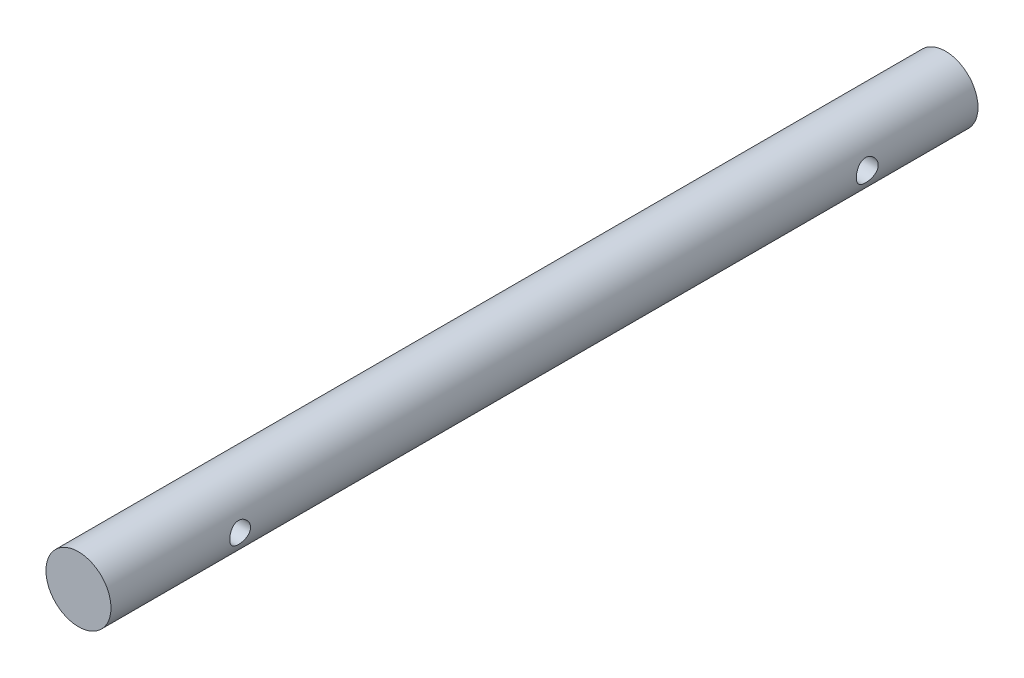
ISO-10303-21;
HEADER;
FILE_DESCRIPTION(('STEP AP214'),'2;1');
FILE_NAME('part.step','',(''),(''),'','','');
FILE_SCHEMA(('AUTOMOTIVE_DESIGN { 1 0 10303 214 1 1 1 1 }'));
ENDSEC;
DATA;
#1=APPLICATION_CONTEXT('core data for automotive mechanical design processes');
#2=APPLICATION_PROTOCOL_DEFINITION('international standard','automotive_design',2000,#1);
#3=PRODUCT_CONTEXT('',#1,'mechanical');
#4=PRODUCT('Part','Part','',(#3));
#5=PRODUCT_RELATED_PRODUCT_CATEGORY('part','',(#4));
#6=PRODUCT_DEFINITION_FORMATION('','',#4);
#7=PRODUCT_DEFINITION_CONTEXT('part definition',#1,'design');
#8=PRODUCT_DEFINITION('design','',#6,#7);
#9=PRODUCT_DEFINITION_SHAPE('','',#8);
#10=(LENGTH_UNIT() NAMED_UNIT(*) SI_UNIT(.MILLI.,.METRE.));
#11=(NAMED_UNIT(*) PLANE_ANGLE_UNIT() SI_UNIT($,.RADIAN.));
#12=(NAMED_UNIT(*) SI_UNIT($,.STERADIAN.) SOLID_ANGLE_UNIT());
#13=UNCERTAINTY_MEASURE_WITH_UNIT(LENGTH_MEASURE(1.E-05),#10,'distance_accuracy_value','');
#14=(GEOMETRIC_REPRESENTATION_CONTEXT(3) GLOBAL_UNCERTAINTY_ASSIGNED_CONTEXT((#13)) GLOBAL_UNIT_ASSIGNED_CONTEXT((#10,
#11,#12)) REPRESENTATION_CONTEXT('',''));
#15=CARTESIAN_POINT('',(0.,0.,0.));
#16=DIRECTION('',(0.,0.,1.));
#17=DIRECTION('',(1.,0.,0.));
#18=AXIS2_PLACEMENT_3D('',#15,#16,#17);
#19=CARTESIAN_POINT('',(0.,0.,31.75));
#20=DIRECTION('',(0.,0.,-1.));
#21=DIRECTION('',(-1.,0.,0.));
#22=AXIS2_PLACEMENT_3D('',#19,#20,#21);
#23=CYLINDRICAL_SURFACE('',#22,2.38125);
#24=CARTESIAN_POINT('',(-2.38125,0.,-24.4417172853251));
#25=CARTESIAN_POINT('',(-2.38125017366265,0.0436362940871859,-24.4417175587776));
#26=CARTESIAN_POINT('',(-2.38003952741135,0.0872708003288124,-24.4381359065205));
#27=CARTESIAN_POINT('',(-2.37532937516095,0.173253384332943,-24.4239486219441));
#28=CARTESIAN_POINT('',(-2.37182966782584,0.215601348593823,-24.4133423717702));
#29=CARTESIAN_POINT('',(-2.36292138699869,0.297758853922842,-24.3855113282575));
#30=CARTESIAN_POINT('',(-2.35751603640355,0.337572547658996,-24.3682977052241));
#31=CARTESIAN_POINT('',(-2.34534736926484,0.413747649473442,-24.3277914233362));
#32=CARTESIAN_POINT('',(-2.33858377821929,0.45010835750784,-24.3044975353672));
#33=CARTESIAN_POINT('',(-2.32414394212591,0.519622405543273,-24.2516330009849));
#34=CARTESIAN_POINT('',(-2.3164455822382,0.552637756898511,-24.2218869837601));
#35=CARTESIAN_POINT('',(-2.30112471637758,0.613317125694659,-24.1573353842819));
#36=CARTESIAN_POINT('',(-2.29350222783475,0.640979939226559,-24.1225286668367));
#37=CARTESIAN_POINT('',(-2.2789519884549,0.690962013085648,-24.0475950267798));
#38=CARTESIAN_POINT('',(-2.27205113698213,0.713100960768009,-24.0073421041824));
#39=CARTESIAN_POINT('',(-2.26006224011407,0.750235838619366,-23.923415016333));
#40=CARTESIAN_POINT('',(-2.25497363147318,0.765233988639424,-23.8797419192292));
#41=CARTESIAN_POINT('',(-2.2474184528922,0.787142201403722,-23.7917846858295));
#42=CARTESIAN_POINT('',(-2.24486822250181,0.794311143506706,-23.7475724317031));
#43=CARTESIAN_POINT('',(-2.24243124454812,0.801166760512426,-23.6585047155866));
#44=CARTESIAN_POINT('',(-2.24254365820344,0.800855791722864,-23.6136494606033));
#45=CARTESIAN_POINT('',(-2.24534602317251,0.792961228374307,-23.5267861814011));
#46=CARTESIAN_POINT('',(-2.24791579900041,0.785716700316742,-23.4847427886265));
#47=CARTESIAN_POINT('',(-2.25514650740915,0.764714245848479,-23.4025070331736));
#48=CARTESIAN_POINT('',(-2.25980769412839,0.750955527852849,-23.362314896106));
#49=CARTESIAN_POINT('',(-2.2707808233559,0.71709554700943,-23.2841571018935));
#50=CARTESIAN_POINT('',(-2.27711842377289,0.696894599412505,-23.2462383891136));
#51=CARTESIAN_POINT('',(-2.29071967750641,0.650792801249575,-23.1742223347209));
#52=CARTESIAN_POINT('',(-2.2979836014782,0.624890283173536,-23.1401261154661));
#53=CARTESIAN_POINT('',(-2.31309058234544,0.566496873097536,-23.0748192797459));
#54=CARTESIAN_POINT('',(-2.32094390945767,0.533729167279254,-23.0438580372772));
#55=CARTESIAN_POINT('',(-2.33600775506844,0.463370348304413,-22.9878044834933));
#56=CARTESIAN_POINT('',(-2.343218209875,0.42577875812391,-22.9627127532956));
#57=CARTESIAN_POINT('',(-2.35628120519132,0.346303891998845,-22.9189053880823));
#58=CARTESIAN_POINT('',(-2.36211911266997,0.304380676663992,-22.9002575468249));
#59=CARTESIAN_POINT('',(-2.37167289182694,0.217749107175726,-22.8703566054507));
#60=CARTESIAN_POINT('',(-2.37538951293848,0.17304174283838,-22.8591008935426));
#61=CARTESIAN_POINT('',(-2.38015734281544,0.0842213388719432,-22.8447477841854));
#62=CARTESIAN_POINT('',(-2.38131854369223,0.0401685730057014,-22.8413134898405));
#63=CARTESIAN_POINT('',(-2.38117519183186,-0.0478931740563565,-22.841739725215));
#64=CARTESIAN_POINT('',(-2.37987106288078,-0.0919021614765199,-22.8455990011817));
#65=CARTESIAN_POINT('',(-2.37501620284189,-0.177272209195475,-22.8602368191078));
#66=CARTESIAN_POINT('',(-2.3715329307582,-0.218673085594223,-22.8708077324741));
#67=CARTESIAN_POINT('',(-2.36273798048716,-0.299096351044241,-22.8983083320247));
#68=CARTESIAN_POINT('',(-2.35742606845266,-0.338118435143076,-22.9152388315004));
#69=CARTESIAN_POINT('',(-2.34533689256879,-0.413830934739977,-22.9554754873719));
#70=CARTESIAN_POINT('',(-2.33852448685211,-0.450432007784605,-22.9789388958965));
#71=CARTESIAN_POINT('',(-2.32420565636303,-0.519286437392175,-23.0313910523304));
#72=CARTESIAN_POINT('',(-2.31669901700418,-0.551538442042284,-23.060381511601));
#73=CARTESIAN_POINT('',(-2.30139768347208,-0.612330633986827,-23.1246487271327));
#74=CARTESIAN_POINT('',(-2.29360570605373,-0.640630455488701,-23.1601540534067));
#75=CARTESIAN_POINT('',(-2.27896796079956,-0.690901110537701,-23.2355763039196));
#76=CARTESIAN_POINT('',(-2.27212220445622,-0.712871867217634,-23.2754932817304));
#77=CARTESIAN_POINT('',(-2.26021723532041,-0.749764603596117,-23.3586383666155));
#78=CARTESIAN_POINT('',(-2.25515493341831,-0.764698786592505,-23.4018605890255));
#79=CARTESIAN_POINT('',(-2.24746808824628,-0.787007431461048,-23.4904163690528));
#80=CARTESIAN_POINT('',(-2.24484242339152,-0.794385371636472,-23.5357489451721));
#81=CARTESIAN_POINT('',(-2.24245504867895,-0.801098177267058,-23.6246934913074));
#82=CARTESIAN_POINT('',(-2.24255104743192,-0.800832639958431,-23.668271814038));
#83=CARTESIAN_POINT('',(-2.24524357757569,-0.793251946155883,-23.7547281756376));
#84=CARTESIAN_POINT('',(-2.24783995554188,-0.785937222203823,-23.7976062573096));
#85=CARTESIAN_POINT('',(-2.25513393292938,-0.764750543076118,-23.8806070080035));
#86=CARTESIAN_POINT('',(-2.25978932284948,-0.751010007066013,-23.9207672247868));
#87=CARTESIAN_POINT('',(-2.27066059728553,-0.717468719910043,-23.9982426747806));
#88=CARTESIAN_POINT('',(-2.27687683159996,-0.697666610095748,-24.0355572678156));
#89=CARTESIAN_POINT('',(-2.29051197560338,-0.651543035917652,-24.1080707159185));
#90=CARTESIAN_POINT('',(-2.29797190677634,-0.624972047394346,-24.1431030937677));
#91=CARTESIAN_POINT('',(-2.31308408359301,-0.566484583367359,-24.208340790405));
#92=CARTESIAN_POINT('',(-2.32073638348802,-0.53456658520884,-24.2385447294087));
#93=CARTESIAN_POINT('',(-2.33573710374907,-0.464764532457037,-24.2944819607654));
#94=CARTESIAN_POINT('',(-2.34306127084098,-0.426693448289243,-24.3199891961634));
#95=CARTESIAN_POINT('',(-2.3562453599393,-0.346561646598847,-24.3642152524098));
#96=CARTESIAN_POINT('',(-2.36210562853211,-0.304501876680163,-24.3829356805486));
#97=CARTESIAN_POINT('',(-2.37150350910379,-0.219286064420704,-24.4123470139141));
#98=CARTESIAN_POINT('',(-2.37512350627007,-0.176238435466475,-24.4233251150007));
#99=CARTESIAN_POINT('',(-2.37999632328026,-0.0887929930108031,-24.4380090667805));
#100=CARTESIAN_POINT('',(-2.38124982331559,-0.0443955712032317,-24.4417170071145));
#101=CARTESIAN_POINT('',(-2.38125,0.,-24.4417172853251));
#102=B_SPLINE_CURVE_WITH_KNOTS('',3,(#24,#25,#26,#27,#28,#29,#30,#31,#32,#33,#34,#35,#36,#37,
#38,#39,#40,#41,#42,#43,#44,#45,#46,#47,#48,#49,#50,#51,#52,#53,#54,#55,#56,#57,#58,#59,#60,#61,
#62,#63,#64,#65,#66,#67,#68,#69,#70,#71,#72,#73,#74,#75,#76,#77,#78,#79,#80,#81,#82,#83,#84,#85,
#86,#87,#88,#89,#90,#91,#92,#93,#94,#95,#96,#97,#98,#99,#100,#101),.UNSPECIFIED.,.T.,.F.,(4,2,2,
2,2,2,2,2,2,2,2,2,2,2,2,2,2,2,2,2,2,2,2,2,2,2,2,2,2,2,2,2,2,2,2,2,2,2,4),(0.,0.130745485225358,
0.261502471811438,0.392039369724982,0.52260267589729,0.657299545596789,0.792026676595712,
0.930701279398339,1.06933274440305,1.20322675830108,1.33707859370694,1.464702340531,
1.59234159979404,1.72206044394308,1.85181727684641,1.988464405931,2.12512505819565,
2.26318256630734,2.40119126958538,2.5331329399258,2.66505193177577,2.79307651310065,
2.921117472341,3.05255588020441,3.1840350521201,3.32158934494302,3.45914530830758,
3.59646182674522,3.73371510694751,3.86380655058794,3.99389001225605,4.12142217670946,
4.24898294775369,4.38218337297993,4.51542179404459,4.65396854863534,4.79248247032798,
4.92554119405749,5.05856166750159),.UNSPECIFIED.);
#103=CARTESIAN_POINT('',(-2.38125,0.,-24.4417172853251));
#104=VERTEX_POINT('',#103);
#105=EDGE_CURVE('E10',#104,#104,#102,.T.);
#106=ORIENTED_EDGE('',*,*,#105,.T.);
#107=EDGE_LOOP('',(#106));
#108=FACE_BOUND('',#107,.T.);
#109=CARTESIAN_POINT('',(2.38125,0.,-24.4417172853251));
#110=CARTESIAN_POINT('',(2.38125017366265,-0.043636294087186,-24.4417175587776));
#111=CARTESIAN_POINT('',(2.38003952741134,-0.0872708003288125,-24.4381359065205));
#112=CARTESIAN_POINT('',(2.37532937516095,-0.173253384332944,-24.4239486219441));
#113=CARTESIAN_POINT('',(2.37182966782584,-0.215601348593823,-24.4133423717702));
#114=CARTESIAN_POINT('',(2.36292138699869,-0.297758853922842,-24.3855113282575));
#115=CARTESIAN_POINT('',(2.35751603640355,-0.337572547658995,-24.3682977052241));
#116=CARTESIAN_POINT('',(2.34534736926484,-0.413747649473441,-24.3277914233362));
#117=CARTESIAN_POINT('',(2.33858377821929,-0.45010835750784,-24.3044975353672));
#118=CARTESIAN_POINT('',(2.32414394212591,-0.519622405543274,-24.2516330009849));
#119=CARTESIAN_POINT('',(2.3164455822382,-0.552637756898511,-24.2218869837601));
#120=CARTESIAN_POINT('',(2.30112471637758,-0.613317125694659,-24.1573353842819));
#121=CARTESIAN_POINT('',(2.29350222783475,-0.640979939226559,-24.1225286668367));
#122=CARTESIAN_POINT('',(2.2789519884549,-0.690962013085648,-24.0475950267798));
#123=CARTESIAN_POINT('',(2.27205113698213,-0.713100960768009,-24.0073421041824));
#124=CARTESIAN_POINT('',(2.26006224011407,-0.750235838619366,-23.923415016333));
#125=CARTESIAN_POINT('',(2.25497363147318,-0.765233988639424,-23.8797419192292));
#126=CARTESIAN_POINT('',(2.2474184528922,-0.787142201403722,-23.7917846858295));
#127=CARTESIAN_POINT('',(2.24486822250181,-0.794311143506706,-23.7475724317031));
#128=CARTESIAN_POINT('',(2.24243124454812,-0.801166760512426,-23.6585047155866));
#129=CARTESIAN_POINT('',(2.24254365820344,-0.800855791722864,-23.6136494606033));
#130=CARTESIAN_POINT('',(2.24534602317251,-0.792961228374307,-23.5267861814011));
#131=CARTESIAN_POINT('',(2.24791579900041,-0.785716700316742,-23.4847427886265));
#132=CARTESIAN_POINT('',(2.25514650740915,-0.764714245848479,-23.4025070331736));
#133=CARTESIAN_POINT('',(2.25980769412839,-0.750955527852849,-23.362314896106));
#134=CARTESIAN_POINT('',(2.2707808233559,-0.71709554700943,-23.2841571018935));
#135=CARTESIAN_POINT('',(2.27711842377289,-0.696894599412505,-23.2462383891136));
#136=CARTESIAN_POINT('',(2.29071967750641,-0.650792801249575,-23.1742223347209));
#137=CARTESIAN_POINT('',(2.2979836014782,-0.624890283173536,-23.1401261154661));
#138=CARTESIAN_POINT('',(2.31309058234544,-0.566496873097536,-23.0748192797459));
#139=CARTESIAN_POINT('',(2.32094390945767,-0.533729167279254,-23.0438580372772));
#140=CARTESIAN_POINT('',(2.33600775506844,-0.463370348304413,-22.9878044834933));
#141=CARTESIAN_POINT('',(2.343218209875,-0.42577875812391,-22.9627127532956));
#142=CARTESIAN_POINT('',(2.35628120519132,-0.346303891998845,-22.9189053880823));
#143=CARTESIAN_POINT('',(2.36211911266997,-0.304380676663992,-22.9002575468249));
#144=CARTESIAN_POINT('',(2.37167289182694,-0.217749107175726,-22.8703566054507));
#145=CARTESIAN_POINT('',(2.37538951293848,-0.17304174283838,-22.8591008935426));
#146=CARTESIAN_POINT('',(2.38015734281544,-0.0842213388719433,-22.8447477841854));
#147=CARTESIAN_POINT('',(2.38131854369223,-0.0401685730057015,-22.8413134898405));
#148=CARTESIAN_POINT('',(2.38117519183186,0.0478931740563564,-22.841739725215));
#149=CARTESIAN_POINT('',(2.37987106288078,0.0919021614765198,-22.8455990011817));
#150=CARTESIAN_POINT('',(2.37501620284189,0.177272209195474,-22.8602368191078));
#151=CARTESIAN_POINT('',(2.3715329307582,0.218673085594223,-22.8708077324741));
#152=CARTESIAN_POINT('',(2.36273798048716,0.29909635104424,-22.8983083320247));
#153=CARTESIAN_POINT('',(2.35742606845266,0.338118435143076,-22.9152388315004));
#154=CARTESIAN_POINT('',(2.34533689256879,0.413830934739977,-22.9554754873719));
#155=CARTESIAN_POINT('',(2.33852448685211,0.450432007784605,-22.9789388958965));
#156=CARTESIAN_POINT('',(2.32420565636303,0.519286437392175,-23.0313910523304));
#157=CARTESIAN_POINT('',(2.31669901700418,0.551538442042284,-23.060381511601));
#158=CARTESIAN_POINT('',(2.30139768347208,0.612330633986827,-23.1246487271327));
#159=CARTESIAN_POINT('',(2.29360570605373,0.640630455488702,-23.1601540534067));
#160=CARTESIAN_POINT('',(2.27896796079956,0.690901110537701,-23.2355763039196));
#161=CARTESIAN_POINT('',(2.27212220445622,0.712871867217634,-23.2754932817304));
#162=CARTESIAN_POINT('',(2.26021723532041,0.749764603596117,-23.3586383666155));
#163=CARTESIAN_POINT('',(2.25515493341831,0.764698786592505,-23.4018605890255));
#164=CARTESIAN_POINT('',(2.24746808824628,0.787007431461049,-23.4904163690528));
#165=CARTESIAN_POINT('',(2.24484242339152,0.794385371636472,-23.5357489451721));
#166=CARTESIAN_POINT('',(2.24245504867895,0.801098177267058,-23.6246934913074));
#167=CARTESIAN_POINT('',(2.24255104743192,0.800832639958431,-23.668271814038));
#168=CARTESIAN_POINT('',(2.24524357757569,0.793251946155883,-23.7547281756376));
#169=CARTESIAN_POINT('',(2.24783995554188,0.785937222203824,-23.7976062573096));
#170=CARTESIAN_POINT('',(2.25513393292938,0.764750543076119,-23.8806070080035));
#171=CARTESIAN_POINT('',(2.25978932284948,0.751010007066013,-23.9207672247868));
#172=CARTESIAN_POINT('',(2.27066059728553,0.717468719910042,-23.9982426747806));
#173=CARTESIAN_POINT('',(2.27687683159996,0.697666610095748,-24.0355572678156));
#174=CARTESIAN_POINT('',(2.29051197560338,0.651543035917652,-24.1080707159185));
#175=CARTESIAN_POINT('',(2.29797190677634,0.624972047394346,-24.1431030937677));
#176=CARTESIAN_POINT('',(2.31308408359301,0.566484583367359,-24.208340790405));
#177=CARTESIAN_POINT('',(2.32073638348802,0.53456658520884,-24.2385447294087));
#178=CARTESIAN_POINT('',(2.33573710374907,0.464764532457037,-24.2944819607654));
#179=CARTESIAN_POINT('',(2.34306127084098,0.426693448289244,-24.3199891961634));
#180=CARTESIAN_POINT('',(2.3562453599393,0.346561646598848,-24.3642152524098));
#181=CARTESIAN_POINT('',(2.36210562853211,0.304501876680163,-24.3829356805486));
#182=CARTESIAN_POINT('',(2.37150350910379,0.219286064420705,-24.4123470139141));
#183=CARTESIAN_POINT('',(2.37512350627007,0.176238435466475,-24.4233251150007));
#184=CARTESIAN_POINT('',(2.37999632328026,0.0887929930108033,-24.4380090667805));
#185=CARTESIAN_POINT('',(2.38124982331559,0.0443955712032317,-24.4417170071145));
#186=CARTESIAN_POINT('',(2.38125,0.,-24.4417172853251));
#187=B_SPLINE_CURVE_WITH_KNOTS('',3,(#109,#110,#111,#112,#113,#114,#115,#116,#117,#118,#119,
#120,#121,#122,#123,#124,#125,#126,#127,#128,#129,#130,#131,#132,#133,#134,#135,#136,#137,#138,
#139,#140,#141,#142,#143,#144,#145,#146,#147,#148,#149,#150,#151,#152,#153,#154,#155,#156,#157,
#158,#159,#160,#161,#162,#163,#164,#165,#166,#167,#168,#169,#170,#171,#172,#173,#174,#175,#176,
#177,#178,#179,#180,#181,#182,#183,#184,#185,#186),.UNSPECIFIED.,.T.,.F.,(4,2,2,2,2,2,2,2,2,2,2,
2,2,2,2,2,2,2,2,2,2,2,2,2,2,2,2,2,2,2,2,2,2,2,2,2,2,2,4),(0.,0.130745485225358,
0.261502471811438,0.392039369724981,0.52260267589729,0.657299545596789,0.792026676595712,
0.930701279398339,1.06933274440305,1.20322675830108,1.33707859370694,1.464702340531,
1.59234159979404,1.72206044394308,1.85181727684641,1.988464405931,2.12512505819565,
2.26318256630734,2.40119126958538,2.5331329399258,2.66505193177577,2.79307651310065,
2.921117472341,3.05255588020441,3.1840350521201,3.32158934494302,3.45914530830758,
3.59646182674522,3.73371510694752,3.86380655058794,3.99389001225605,4.12142217670945,
4.24898294775369,4.38218337297993,4.51542179404459,4.65396854863535,4.79248247032798,
4.92554119405749,5.05856166750159),.UNSPECIFIED.);
#188=CARTESIAN_POINT('',(2.38125,0.,-24.4417172853251));
#189=VERTEX_POINT('',#188);
#190=EDGE_CURVE('E40',#189,#189,#187,.T.);
#191=ORIENTED_EDGE('',*,*,#190,.T.);
#192=EDGE_LOOP('',(#191));
#193=FACE_BOUND('',#192,.T.);
#194=CARTESIAN_POINT('',(-2.38125,0.,21.5265));
#195=CARTESIAN_POINT('',(-2.38124989781402,0.0416698777579853,21.5265001160386));
#196=CARTESIAN_POINT('',(-2.38014597704467,0.0833411958993777,21.5299292835017));
#197=CARTESIAN_POINT('',(-2.37585057359521,0.165462061714351,21.5435172790508));
#198=CARTESIAN_POINT('',(-2.37265870981123,0.205911384931728,21.5536773357033));
#199=CARTESIAN_POINT('',(-2.36453545206373,0.284392318783233,21.5803471687271));
#200=CARTESIAN_POINT('',(-2.35960682849057,0.322427666699415,21.5968468362415));
#201=CARTESIAN_POINT('',(-2.34851686907383,0.395191660807861,21.635683565329));
#202=CARTESIAN_POINT('',(-2.3423553211543,0.429919736595622,21.6580216313708));
#203=CARTESIAN_POINT('',(-2.32922953603617,0.496202378399867,21.7086580590563));
#204=CARTESIAN_POINT('',(-2.32224718620803,0.527635513932378,21.7371106558768));
#205=CARTESIAN_POINT('',(-2.30836977540586,0.585375180338968,21.798840260443));
#206=CARTESIAN_POINT('',(-2.30147473194925,0.611680697167849,21.8321182201949));
#207=CARTESIAN_POINT('',(-2.28835653644959,0.659089019039234,21.9036199219613));
#208=CARTESIAN_POINT('',(-2.28215564166123,0.680037961311529,21.941950153958));
#209=CARTESIAN_POINT('',(-2.27140130769351,0.715141367853063,22.0218201662176));
#210=CARTESIAN_POINT('',(-2.26684741056426,0.729297721168892,22.063359050406));
#211=CARTESIAN_POINT('',(-2.26009258491044,0.749965802157107,22.1470930917158));
#212=CARTESIAN_POINT('',(-2.25782226458324,0.756703608733756,22.1892266884811));
#213=CARTESIAN_POINT('',(-2.2556858838124,0.763049812445892,22.2740827691377));
#214=CARTESIAN_POINT('',(-2.25581914824762,0.762660211533869,22.3168050843006));
#215=CARTESIAN_POINT('',(-2.25841378572233,0.754939025756186,22.399735609801));
#216=CARTESIAN_POINT('',(-2.26077788294756,0.747897485656879,22.4399743859525));
#217=CARTESIAN_POINT('',(-2.26740937865217,0.727543593364557,22.5186663121565));
#218=CARTESIAN_POINT('',(-2.27167698838874,0.714230545132729,22.5571192634901));
#219=CARTESIAN_POINT('',(-2.28170734043658,0.68151206006878,22.6318276052656));
#220=CARTESIAN_POINT('',(-2.28749175534307,0.66201737565646,22.6680408747518));
#221=CARTESIAN_POINT('',(-2.29989433115608,0.617550966766011,22.7367760479915));
#222=CARTESIAN_POINT('',(-2.30651271717305,0.592577762139328,22.7692969505566));
#223=CARTESIAN_POINT('',(-2.3202250973243,0.536450626711086,22.8313605504526));
#224=CARTESIAN_POINT('',(-2.32732669284859,0.505058058887776,22.8606861700171));
#225=CARTESIAN_POINT('',(-2.34092671314747,0.437712532093417,22.9137108455088));
#226=CARTESIAN_POINT('',(-2.34742508876563,0.401759202029595,22.9374094431343));
#227=CARTESIAN_POINT('',(-2.35916052365848,0.325879577814266,22.9786640898622));
#228=CARTESIAN_POINT('',(-2.36438637110955,0.285922059333601,22.9961661142733));
#229=CARTESIAN_POINT('',(-2.37290686723971,0.203423448734487,23.0241346079106));
#230=CARTESIAN_POINT('',(-2.37620213197458,0.160883185566399,23.0346033216477));
#231=CARTESIAN_POINT('',(-2.38039000793888,0.0762675272919117,23.0478330317493));
#232=CARTESIAN_POINT('',(-2.38137411159848,0.0342425112156301,23.0508877025573));
#233=CARTESIAN_POINT('',(-2.38110072095407,-0.049725390891335,23.0500336473221));
#234=CARTESIAN_POINT('',(-2.37984357185746,-0.091668288574141,23.0461259936462));
#235=CARTESIAN_POINT('',(-2.37528916126214,-0.173133552419567,23.0316928336451));
#236=CARTESIAN_POINT('',(-2.37204640516737,-0.212690565130165,23.0213440178216));
#237=CARTESIAN_POINT('',(-2.3639030033026,-0.289494113003518,22.9945397680375));
#238=CARTESIAN_POINT('',(-2.35900215002993,-0.326740358294421,22.9780835697433));
#239=CARTESIAN_POINT('',(-2.34789121648323,-0.398905534993329,22.9390713030688));
#240=CARTESIAN_POINT('',(-2.34165136636484,-0.433742601763699,22.9163725161872));
#241=CARTESIAN_POINT('',(-2.32857393174175,-0.499210728306789,22.8656893429909));
#242=CARTESIAN_POINT('',(-2.32173617803207,-0.529840591107162,22.8377034578253));
#243=CARTESIAN_POINT('',(-2.30787400670016,-0.587351131090065,22.7758589314842));
#244=CARTESIAN_POINT('',(-2.30085368589638,-0.614022359754316,22.7418041475093));
#245=CARTESIAN_POINT('',(-2.28771661025976,-0.661292851237938,22.6695501612934));
#246=CARTESIAN_POINT('',(-2.28159984798353,-0.681892164078364,22.6313509931977));
#247=CARTESIAN_POINT('',(-2.27102795219276,-0.716316101188809,22.5519407456545));
#248=CARTESIAN_POINT('',(-2.26656736633257,-0.730163003309153,22.5107400931643));
#249=CARTESIAN_POINT('',(-2.25985997972441,-0.750668432542492,22.4264185662769));
#250=CARTESIAN_POINT('',(-2.25761228311064,-0.757329868723114,22.3832984763404));
#251=CARTESIAN_POINT('',(-2.25568158161365,-0.763059824417202,22.2985603197033));
#252=CARTESIAN_POINT('',(-2.2558820414791,-0.762473337476071,22.2569679583775));
#253=CARTESIAN_POINT('',(-2.25854018332825,-0.754562666403061,22.1745062261767));
#254=CARTESIAN_POINT('',(-2.2609977502078,-0.747238825851362,22.133636818542));
#255=CARTESIAN_POINT('',(-2.26780983655685,-0.726297120631817,22.0544310186576));
#256=CARTESIAN_POINT('',(-2.27213315841989,-0.712782553076714,22.0160644265255));
#257=CARTESIAN_POINT('',(-2.28218035881335,-0.679925110894791,21.9421130116109));
#258=CARTESIAN_POINT('',(-2.28790453185821,-0.660581010471019,21.9065287758685));
#259=CARTESIAN_POINT('',(-2.30039939191655,-0.615692507694024,21.8375819138004));
#260=CARTESIAN_POINT('',(-2.30720321698495,-0.589927581405358,21.8043688898728));
#261=CARTESIAN_POINT('',(-2.32094332378897,-0.533311416513642,21.7426261810529));
#262=CARTESIAN_POINT('',(-2.32787964119083,-0.502458790769501,21.7140977776492));
#263=CARTESIAN_POINT('',(-2.34139315280209,-0.435250690154579,21.6615367413287));
#264=CARTESIAN_POINT('',(-2.34794941833008,-0.398740956276067,21.6376953491651));
#265=CARTESIAN_POINT('',(-2.35969391391132,-0.322022881127705,21.5965181854187));
#266=CARTESIAN_POINT('',(-2.3648826165771,-0.281815824102885,21.5791801654735));
#267=CARTESIAN_POINT('',(-2.37300297431755,-0.201769709320857,21.5525757448557));
#268=CARTESIAN_POINT('',(-2.37606792994814,-0.162104435039591,21.5428265879098));
#269=CARTESIAN_POINT('',(-2.3801912654909,-0.0816263930125016,21.529789390692));
#270=CARTESIAN_POINT('',(-2.38125010008685,-0.0408138874132392,21.5264998863451));
#271=CARTESIAN_POINT('',(-2.38125,0.,21.5265));
#272=B_SPLINE_CURVE_WITH_KNOTS('',3,(#194,#195,#196,#197,#198,#199,#200,#201,#202,#203,#204,
#205,#206,#207,#208,#209,#210,#211,#212,#213,#214,#215,#216,#217,#218,#219,#220,#221,#222,#223,
#224,#225,#226,#227,#228,#229,#230,#231,#232,#233,#234,#235,#236,#237,#238,#239,#240,#241,#242,
#243,#244,#245,#246,#247,#248,#249,#250,#251,#252,#253,#254,#255,#256,#257,#258,#259,#260,#261,
#262,#263,#264,#265,#266,#267,#268,#269,#270,#271),.UNSPECIFIED.,.T.,.F.,(4,2,2,2,2,2,2,2,2,2,2,
2,2,2,2,2,2,2,2,2,2,2,2,2,2,2,2,2,2,2,2,2,2,2,2,2,2,2,4),(0.,0.124859553048914,
0.249741902573408,0.374425941255703,0.499131445369397,0.627458032696839,0.755809972383378,
0.887514872286811,1.01918312326268,1.1467170835965,1.27421522262939,1.39639876298315,
1.51859586698508,1.64264433308621,1.76672635510635,1.89674794384796,2.02678011877134,
2.157919569676,2.28901715069288,2.41483043788817,2.54062434845387,2.66311102049373,
2.78561302680945,2.91118935339672,3.03680133345434,3.16764825436209,3.29849409730959,
3.4289052770216,3.55926363935207,3.6834419677061,3.80761396377451,3.92978555635455,
4.05198285634314,4.17915926605136,4.30637040740737,4.4380131847249,4.56961040812412,
4.6919328005865,4.81422746557694),.UNSPECIFIED.);
#273=CARTESIAN_POINT('',(-2.38125,0.,21.5265));
#274=VERTEX_POINT('',#273);
#275=EDGE_CURVE('E44',#274,#274,#272,.T.);
#276=ORIENTED_EDGE('',*,*,#275,.T.);
#277=EDGE_LOOP('',(#276));
#278=FACE_BOUND('',#277,.T.);
#279=CARTESIAN_POINT('',(2.38125,0.,21.5265));
#280=CARTESIAN_POINT('',(2.38124989781402,-0.0416698777579853,21.5265001160386));
#281=CARTESIAN_POINT('',(2.38014597704466,-0.0833411958993779,21.5299292835017));
#282=CARTESIAN_POINT('',(2.37585057359521,-0.165462061714351,21.5435172790508));
#283=CARTESIAN_POINT('',(2.37265870981123,-0.205911384931727,21.5536773357033));
#284=CARTESIAN_POINT('',(2.36453545206373,-0.284392318783233,21.5803471687271));
#285=CARTESIAN_POINT('',(2.35960682849057,-0.322427666699414,21.5968468362415));
#286=CARTESIAN_POINT('',(2.34851686907383,-0.395191660807861,21.635683565329));
#287=CARTESIAN_POINT('',(2.3423553211543,-0.429919736595622,21.6580216313708));
#288=CARTESIAN_POINT('',(2.32922953603617,-0.496202378399866,21.7086580590563));
#289=CARTESIAN_POINT('',(2.32224718620803,-0.527635513932377,21.7371106558768));
#290=CARTESIAN_POINT('',(2.30836977540586,-0.585375180338967,21.798840260443));
#291=CARTESIAN_POINT('',(2.30147473194925,-0.611680697167848,21.8321182201949));
#292=CARTESIAN_POINT('',(2.28835653644959,-0.659089019039234,21.9036199219613));
#293=CARTESIAN_POINT('',(2.28215564166123,-0.680037961311529,21.941950153958));
#294=CARTESIAN_POINT('',(2.27140130769351,-0.715141367853063,22.0218201662176));
#295=CARTESIAN_POINT('',(2.26684741056426,-0.729297721168892,22.063359050406));
#296=CARTESIAN_POINT('',(2.26009258491044,-0.749965802157107,22.1470930917158));
#297=CARTESIAN_POINT('',(2.25782226458324,-0.756703608733756,22.1892266884811));
#298=CARTESIAN_POINT('',(2.2556858838124,-0.763049812445892,22.2740827691377));
#299=CARTESIAN_POINT('',(2.25581914824762,-0.762660211533869,22.3168050843006));
#300=CARTESIAN_POINT('',(2.25841378572233,-0.754939025756186,22.399735609801));
#301=CARTESIAN_POINT('',(2.26077788294756,-0.747897485656879,22.4399743859525));
#302=CARTESIAN_POINT('',(2.26740937865217,-0.727543593364557,22.5186663121565));
#303=CARTESIAN_POINT('',(2.27167698838874,-0.714230545132729,22.5571192634901));
#304=CARTESIAN_POINT('',(2.28170734043658,-0.68151206006878,22.6318276052656));
#305=CARTESIAN_POINT('',(2.28749175534307,-0.66201737565646,22.6680408747518));
#306=CARTESIAN_POINT('',(2.29989433115608,-0.617550966766011,22.7367760479915));
#307=CARTESIAN_POINT('',(2.30651271717305,-0.592577762139328,22.7692969505566));
#308=CARTESIAN_POINT('',(2.32022509732429,-0.536450626711087,22.8313605504526));
#309=CARTESIAN_POINT('',(2.32732669284859,-0.505058058887777,22.8606861700171));
#310=CARTESIAN_POINT('',(2.34092671314747,-0.437712532093419,22.9137108455088));
#311=CARTESIAN_POINT('',(2.34742508876563,-0.401759202029598,22.9374094431343));
#312=CARTESIAN_POINT('',(2.35916052365848,-0.32587957781427,22.9786640898622));
#313=CARTESIAN_POINT('',(2.36438637110955,-0.285922059333605,22.9961661142733));
#314=CARTESIAN_POINT('',(2.37290686723971,-0.20342344873449,23.0241346079106));
#315=CARTESIAN_POINT('',(2.37620213197458,-0.1608831855664,23.0346033216477));
#316=CARTESIAN_POINT('',(2.38039000793888,-0.0762675272919121,23.0478330317493));
#317=CARTESIAN_POINT('',(2.38137411159848,-0.0342425112156306,23.0508877025573));
#318=CARTESIAN_POINT('',(2.38110072095407,0.0497253908913348,23.0500336473221));
#319=CARTESIAN_POINT('',(2.37984357185746,0.091668288574141,23.0461259936462));
#320=CARTESIAN_POINT('',(2.37528916126214,0.173133552419567,23.0316928336451));
#321=CARTESIAN_POINT('',(2.37204640516737,0.212690565130165,23.0213440178216));
#322=CARTESIAN_POINT('',(2.3639030033026,0.289494113003518,22.9945397680375));
#323=CARTESIAN_POINT('',(2.35900215002993,0.326740358294422,22.9780835697433));
#324=CARTESIAN_POINT('',(2.34789121648323,0.398905534993329,22.9390713030688));
#325=CARTESIAN_POINT('',(2.34165136636484,0.433742601763699,22.9163725161872));
#326=CARTESIAN_POINT('',(2.32857393174175,0.49921072830679,22.8656893429909));
#327=CARTESIAN_POINT('',(2.32173617803207,0.529840591107163,22.8377034578253));
#328=CARTESIAN_POINT('',(2.30787400670016,0.587351131090065,22.7758589314842));
#329=CARTESIAN_POINT('',(2.30085368589638,0.614022359754316,22.7418041475093));
#330=CARTESIAN_POINT('',(2.28771661025976,0.661292851237938,22.6695501612934));
#331=CARTESIAN_POINT('',(2.28159984798353,0.681892164078364,22.6313509931977));
#332=CARTESIAN_POINT('',(2.27102795219276,0.716316101188809,22.5519407456545));
#333=CARTESIAN_POINT('',(2.26656736633257,0.730163003309153,22.5107400931643));
#334=CARTESIAN_POINT('',(2.25985997972441,0.750668432542492,22.4264185662769));
#335=CARTESIAN_POINT('',(2.25761228311064,0.757329868723114,22.3832984763404));
#336=CARTESIAN_POINT('',(2.25568158161365,0.763059824417202,22.2985603197033));
#337=CARTESIAN_POINT('',(2.2558820414791,0.762473337476071,22.2569679583775));
#338=CARTESIAN_POINT('',(2.25854018332825,0.754562666403061,22.1745062261767));
#339=CARTESIAN_POINT('',(2.2609977502078,0.747238825851362,22.133636818542));
#340=CARTESIAN_POINT('',(2.26780983655685,0.726297120631817,22.0544310186576));
#341=CARTESIAN_POINT('',(2.27213315841989,0.712782553076714,22.0160644265255));
#342=CARTESIAN_POINT('',(2.28218035881335,0.679925110894791,21.9421130116109));
#343=CARTESIAN_POINT('',(2.28790453185821,0.660581010471019,21.9065287758685));
#344=CARTESIAN_POINT('',(2.30039939191655,0.615692507694024,21.8375819138004));
#345=CARTESIAN_POINT('',(2.30720321698495,0.589927581405358,21.8043688898728));
#346=CARTESIAN_POINT('',(2.32094332378897,0.533311416513642,21.7426261810529));
#347=CARTESIAN_POINT('',(2.32787964119083,0.502458790769501,21.7140977776492));
#348=CARTESIAN_POINT('',(2.34139315280209,0.435250690154579,21.6615367413287));
#349=CARTESIAN_POINT('',(2.34794941833008,0.398740956276067,21.6376953491651));
#350=CARTESIAN_POINT('',(2.35969391391132,0.322022881127705,21.5965181854187));
#351=CARTESIAN_POINT('',(2.3648826165771,0.281815824102885,21.5791801654735));
#352=CARTESIAN_POINT('',(2.37300297431755,0.201769709320857,21.5525757448557));
#353=CARTESIAN_POINT('',(2.37606792994814,0.162104435039591,21.5428265879098));
#354=CARTESIAN_POINT('',(2.3801912654909,0.0816263930125018,21.529789390692));
#355=CARTESIAN_POINT('',(2.38125010008685,0.0408138874132393,21.5264998863451));
#356=CARTESIAN_POINT('',(2.38125,0.,21.5265));
#357=B_SPLINE_CURVE_WITH_KNOTS('',3,(#279,#280,#281,#282,#283,#284,#285,#286,#287,#288,#289,
#290,#291,#292,#293,#294,#295,#296,#297,#298,#299,#300,#301,#302,#303,#304,#305,#306,#307,#308,
#309,#310,#311,#312,#313,#314,#315,#316,#317,#318,#319,#320,#321,#322,#323,#324,#325,#326,#327,
#328,#329,#330,#331,#332,#333,#334,#335,#336,#337,#338,#339,#340,#341,#342,#343,#344,#345,#346,
#347,#348,#349,#350,#351,#352,#353,#354,#355,#356),.UNSPECIFIED.,.T.,.F.,(4,2,2,2,2,2,2,2,2,2,2,
2,2,2,2,2,2,2,2,2,2,2,2,2,2,2,2,2,2,2,2,2,2,2,2,2,2,2,4),(0.,0.124859553048914,
0.249741902573408,0.374425941255701,0.499131445369398,0.627458032696836,0.755809972383378,
0.887514872286811,1.01918312326268,1.1467170835965,1.27421522262939,1.39639876298315,
1.51859586698508,1.64264433308621,1.76672635510635,1.89674794384796,2.02678011877133,
2.15791956967599,2.28901715069288,2.41483043788817,2.54062434845387,2.66311102049374,
2.78561302680946,2.91118935339672,3.03680133345434,3.16764825436209,3.29849409730959,
3.4289052770216,3.55926363935207,3.68344196770611,3.80761396377451,3.92978555635455,
4.05198285634314,4.17915926605136,4.30637040740737,4.43801318472491,4.56961040812412,
4.6919328005865,4.81422746557695),.UNSPECIFIED.);
#358=CARTESIAN_POINT('',(2.38125,0.,21.5265));
#359=VERTEX_POINT('',#358);
#360=EDGE_CURVE('E48',#359,#359,#357,.T.);
#361=ORIENTED_EDGE('',*,*,#360,.T.);
#362=EDGE_LOOP('',(#361));
#363=FACE_BOUND('',#362,.T.);
#364=CARTESIAN_POINT('',(0.,0.,31.75));
#365=DIRECTION('',(0.,0.,1.));
#366=DIRECTION('',(1.,0.,0.));
#367=AXIS2_PLACEMENT_3D('',#364,#365,#366);
#368=CIRCLE('',#367,2.38125);
#369=CARTESIAN_POINT('',(2.38125,0.,31.75));
#370=VERTEX_POINT('',#369);
#371=EDGE_CURVE('E73',#370,#370,#368,.T.);
#372=ORIENTED_EDGE('',*,*,#371,.F.);
#373=EDGE_LOOP('',(#372));
#374=FACE_BOUND('',#373,.T.);
#375=CARTESIAN_POINT('',(0.,0.,-31.75));
#376=DIRECTION('',(0.,0.,1.));
#377=DIRECTION('',(1.,0.,0.));
#378=AXIS2_PLACEMENT_3D('',#375,#376,#377);
#379=CIRCLE('',#378,2.38125);
#380=CARTESIAN_POINT('',(2.38125,0.,-31.75));
#381=VERTEX_POINT('',#380);
#382=EDGE_CURVE('E74',#381,#381,#379,.T.);
#383=ORIENTED_EDGE('',*,*,#382,.T.);
#384=EDGE_LOOP('',(#383));
#385=FACE_BOUND('',#384,.T.);
#386=ADVANCED_FACE('F30',(#108,#193,#278,#363,#374,#385),#23,.T.);
#387=CARTESIAN_POINT('',(0.,0.,31.75));
#388=DIRECTION('',(0.,0.,1.));
#389=DIRECTION('',(1.,0.,0.));
#390=AXIS2_PLACEMENT_3D('',#387,#388,#389);
#391=PLANE('',#390);
#392=ORIENTED_EDGE('',*,*,#371,.T.);
#393=EDGE_LOOP('',(#392));
#394=FACE_BOUND('',#393,.T.);
#395=ADVANCED_FACE('F67',(#394),#391,.T.);
#396=CARTESIAN_POINT('',(0.,0.,-31.75));
#397=DIRECTION('',(0.,0.,1.));
#398=DIRECTION('',(1.,0.,0.));
#399=AXIS2_PLACEMENT_3D('',#396,#397,#398);
#400=PLANE('',#399);
#401=ORIENTED_EDGE('',*,*,#382,.F.);
#402=EDGE_LOOP('',(#401));
#403=FACE_BOUND('',#402,.T.);
#404=ADVANCED_FACE('F65',(#403),#400,.F.);
#405=CARTESIAN_POINT('',(-2.38125,0.,22.2885));
#406=DIRECTION('',(1.,0.,0.));
#407=DIRECTION('',(0.,0.,-1.));
#408=AXIS2_PLACEMENT_3D('',#405,#406,#407);
#409=CYLINDRICAL_SURFACE('',#408,0.761999999999999);
#410=ORIENTED_EDGE('',*,*,#360,.F.);
#411=EDGE_LOOP('',(#410));
#412=FACE_BOUND('',#411,.T.);
#413=ORIENTED_EDGE('',*,*,#275,.F.);
#414=EDGE_LOOP('',(#413));
#415=FACE_BOUND('',#414,.T.);
#416=ADVANCED_FACE('F59',(#412,#415),#409,.F.);
#417=CARTESIAN_POINT('',(-2.38125,0.,-23.6416172853251));
#418=DIRECTION('',(1.,0.,0.));
#419=DIRECTION('',(0.,0.,-1.));
#420=AXIS2_PLACEMENT_3D('',#417,#418,#419);
#421=CYLINDRICAL_SURFACE('',#420,0.8001);
#422=ORIENTED_EDGE('',*,*,#190,.F.);
#423=EDGE_LOOP('',(#422));
#424=FACE_BOUND('',#423,.T.);
#425=ORIENTED_EDGE('',*,*,#105,.F.);
#426=EDGE_LOOP('',(#425));
#427=FACE_BOUND('',#426,.T.);
#428=ADVANCED_FACE('F56',(#424,#427),#421,.F.);
#429=CLOSED_SHELL('',(#386,#395,#404,#416,#428));
#430=MANIFOLD_SOLID_BREP('B2',#429);
#431=ADVANCED_BREP_SHAPE_REPRESENTATION('',(#18,#430),#14);
#432=SHAPE_DEFINITION_REPRESENTATION(#9,#431);
ENDSEC;
END-ISO-10303-21;
